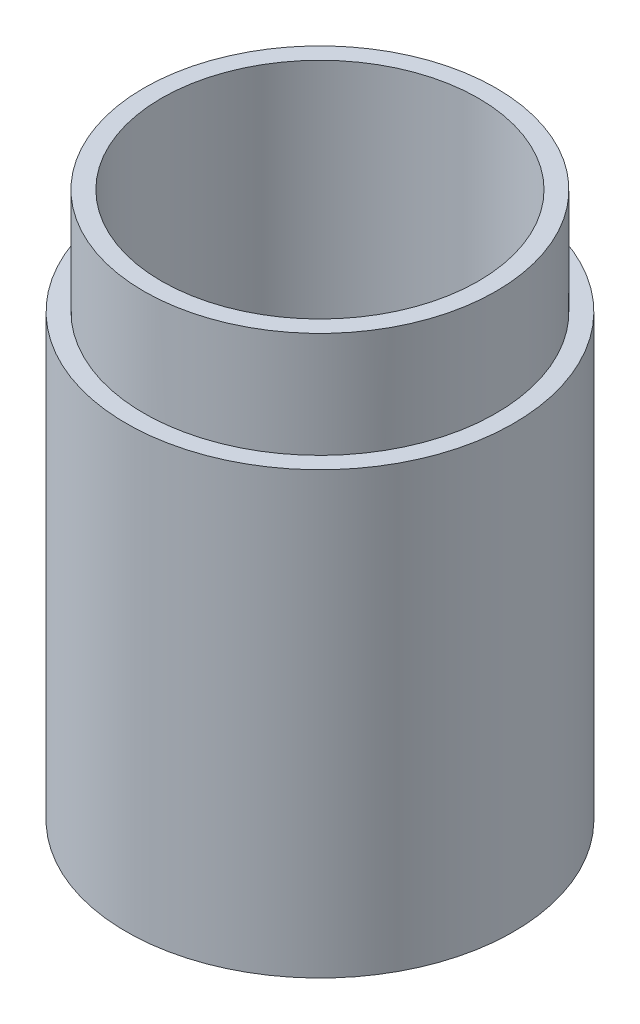
ISO-10303-21;
HEADER;
FILE_DESCRIPTION(('STEP AP214'),'2;1');
FILE_NAME('part.step','',(''),(''),'','','');
FILE_SCHEMA(('AUTOMOTIVE_DESIGN { 1 0 10303 214 1 1 1 1 }'));
ENDSEC;
DATA;
#1=APPLICATION_CONTEXT('core data for automotive mechanical design processes');
#2=APPLICATION_PROTOCOL_DEFINITION('international standard','automotive_design',2000,#1);
#3=PRODUCT_CONTEXT('',#1,'mechanical');
#4=PRODUCT('Part','Part','',(#3));
#5=PRODUCT_RELATED_PRODUCT_CATEGORY('part','',(#4));
#6=PRODUCT_DEFINITION_FORMATION('','',#4);
#7=PRODUCT_DEFINITION_CONTEXT('part definition',#1,'design');
#8=PRODUCT_DEFINITION('design','',#6,#7);
#9=PRODUCT_DEFINITION_SHAPE('','',#8);
#10=(LENGTH_UNIT() NAMED_UNIT(*) SI_UNIT(.MILLI.,.METRE.));
#11=(NAMED_UNIT(*) PLANE_ANGLE_UNIT() SI_UNIT($,.RADIAN.));
#12=(NAMED_UNIT(*) SI_UNIT($,.STERADIAN.) SOLID_ANGLE_UNIT());
#13=UNCERTAINTY_MEASURE_WITH_UNIT(LENGTH_MEASURE(1.E-05),#10,'distance_accuracy_value','');
#14=(GEOMETRIC_REPRESENTATION_CONTEXT(3) GLOBAL_UNCERTAINTY_ASSIGNED_CONTEXT((#13)) GLOBAL_UNIT_ASSIGNED_CONTEXT((#10,
#11,#12)) REPRESENTATION_CONTEXT('',''));
#15=CARTESIAN_POINT('',(0.,0.,0.));
#16=DIRECTION('',(0.,0.,1.));
#17=DIRECTION('',(1.,0.,0.));
#18=AXIS2_PLACEMENT_3D('',#15,#16,#17);
#19=CARTESIAN_POINT('',(0.,150.,0.));
#20=DIRECTION('',(0.,-1.,0.));
#21=DIRECTION('',(0.,0.,-1.));
#22=AXIS2_PLACEMENT_3D('',#19,#20,#21);
#23=CYLINDRICAL_SURFACE('',#22,50.);
#24=CARTESIAN_POINT('',(0.,150.,0.));
#25=DIRECTION('',(0.,1.,0.));
#26=DIRECTION('',(0.,0.,1.));
#27=AXIS2_PLACEMENT_3D('',#24,#25,#26);
#28=CIRCLE('',#27,50.);
#29=CARTESIAN_POINT('',(0.,150.,50.));
#30=VERTEX_POINT('',#29);
#31=EDGE_CURVE('E45',#30,#30,#28,.T.);
#32=ORIENTED_EDGE('',*,*,#31,.F.);
#33=EDGE_LOOP('',(#32));
#34=FACE_BOUND('',#33,.T.);
#35=CARTESIAN_POINT('',(0.,120.,0.));
#36=DIRECTION('',(0.,-1.,0.));
#37=DIRECTION('',(0.,0.,-1.));
#38=AXIS2_PLACEMENT_3D('',#35,#36,#37);
#39=CIRCLE('',#38,50.);
#40=CARTESIAN_POINT('',(0.,120.,-50.));
#41=VERTEX_POINT('',#40);
#42=EDGE_CURVE('E10',#41,#41,#39,.T.);
#43=ORIENTED_EDGE('',*,*,#42,.F.);
#44=EDGE_LOOP('',(#43));
#45=FACE_BOUND('',#44,.T.);
#46=ADVANCED_FACE('F37',(#34,#45),#23,.T.);
#47=CARTESIAN_POINT('',(0.,150.,0.));
#48=DIRECTION('',(0.,1.,0.));
#49=DIRECTION('',(0.,0.,1.));
#50=AXIS2_PLACEMENT_3D('',#47,#48,#49);
#51=PLANE('',#50);
#52=CARTESIAN_POINT('',(0.,150.,0.));
#53=DIRECTION('',(0.,1.,0.));
#54=DIRECTION('',(0.,0.,1.));
#55=AXIS2_PLACEMENT_3D('',#52,#53,#54);
#56=CIRCLE('',#55,45.);
#57=CARTESIAN_POINT('',(0.,150.,45.));
#58=VERTEX_POINT('',#57);
#59=EDGE_CURVE('E50',#58,#58,#56,.T.);
#60=ORIENTED_EDGE('',*,*,#59,.F.);
#61=EDGE_LOOP('',(#60));
#62=FACE_BOUND('',#61,.T.);
#63=ORIENTED_EDGE('',*,*,#31,.T.);
#64=EDGE_LOOP('',(#63));
#65=FACE_BOUND('',#64,.T.);
#66=ADVANCED_FACE('F84',(#62,#65),#51,.T.);
#67=CARTESIAN_POINT('',(0.,150.,0.));
#68=DIRECTION('',(0.,-1.,0.));
#69=DIRECTION('',(0.,0.,-1.));
#70=AXIS2_PLACEMENT_3D('',#67,#68,#69);
#71=CYLINDRICAL_SURFACE('',#70,45.);
#72=ORIENTED_EDGE('',*,*,#59,.T.);
#73=EDGE_LOOP('',(#72));
#74=FACE_BOUND('',#73,.T.);
#75=CARTESIAN_POINT('',(0.,0.,0.));
#76=DIRECTION('',(0.,1.,0.));
#77=DIRECTION('',(0.,0.,1.));
#78=AXIS2_PLACEMENT_3D('',#75,#76,#77);
#79=CIRCLE('',#78,45.);
#80=CARTESIAN_POINT('',(0.,0.,45.));
#81=VERTEX_POINT('',#80);
#82=EDGE_CURVE('E55',#81,#81,#79,.T.);
#83=ORIENTED_EDGE('',*,*,#82,.F.);
#84=EDGE_LOOP('',(#83));
#85=FACE_BOUND('',#84,.T.);
#86=ADVANCED_FACE('F91',(#74,#85),#71,.F.);
#87=CARTESIAN_POINT('',(0.,0.,0.));
#88=DIRECTION('',(0.,1.,0.));
#89=DIRECTION('',(0.,0.,1.));
#90=AXIS2_PLACEMENT_3D('',#87,#88,#89);
#91=PLANE('',#90);
#92=ORIENTED_EDGE('',*,*,#82,.T.);
#93=EDGE_LOOP('',(#92));
#94=FACE_BOUND('',#93,.T.);
#95=ADVANCED_FACE('F81',(#94),#91,.T.);
#96=CARTESIAN_POINT('',(0.,120.,0.));
#97=DIRECTION('',(0.,-1.,0.));
#98=DIRECTION('',(0.,0.,-1.));
#99=AXIS2_PLACEMENT_3D('',#96,#97,#98);
#100=CYLINDRICAL_SURFACE('',#99,55.);
#101=CARTESIAN_POINT('',(0.,120.,0.));
#102=DIRECTION('',(0.,-1.,0.));
#103=DIRECTION('',(0.,0.,-1.));
#104=AXIS2_PLACEMENT_3D('',#101,#102,#103);
#105=CIRCLE('',#104,55.);
#106=CARTESIAN_POINT('',(0.,120.,-55.));
#107=VERTEX_POINT('',#106);
#108=EDGE_CURVE('E60',#107,#107,#105,.T.);
#109=ORIENTED_EDGE('',*,*,#108,.T.);
#110=EDGE_LOOP('',(#109));
#111=FACE_BOUND('',#110,.T.);
#112=CARTESIAN_POINT('',(0.,-5.,0.));
#113=DIRECTION('',(0.,-1.,0.));
#114=DIRECTION('',(0.,0.,-1.));
#115=AXIS2_PLACEMENT_3D('',#112,#113,#114);
#116=CIRCLE('',#115,55.);
#117=CARTESIAN_POINT('',(0.,-5.,-55.));
#118=VERTEX_POINT('',#117);
#119=EDGE_CURVE('E62',#118,#118,#116,.T.);
#120=ORIENTED_EDGE('',*,*,#119,.F.);
#121=EDGE_LOOP('',(#120));
#122=FACE_BOUND('',#121,.T.);
#123=ADVANCED_FACE('F70',(#111,#122),#100,.T.);
#124=CARTESIAN_POINT('',(0.,120.,0.));
#125=DIRECTION('',(0.,-1.,0.));
#126=DIRECTION('',(0.,0.,-1.));
#127=AXIS2_PLACEMENT_3D('',#124,#125,#126);
#128=PLANE('',#127);
#129=ORIENTED_EDGE('',*,*,#42,.T.);
#130=EDGE_LOOP('',(#129));
#131=FACE_BOUND('',#130,.T.);
#132=ORIENTED_EDGE('',*,*,#108,.F.);
#133=EDGE_LOOP('',(#132));
#134=FACE_BOUND('',#133,.T.);
#135=ADVANCED_FACE('F73',(#131,#134),#128,.F.);
#136=CARTESIAN_POINT('',(0.,-5.,0.));
#137=DIRECTION('',(0.,1.,0.));
#138=DIRECTION('',(0.,0.,1.));
#139=AXIS2_PLACEMENT_3D('',#136,#137,#138);
#140=PLANE('',#139);
#141=ORIENTED_EDGE('',*,*,#119,.T.);
#142=EDGE_LOOP('',(#141));
#143=FACE_BOUND('',#142,.T.);
#144=ADVANCED_FACE('F39',(#143),#140,.F.);
#145=CLOSED_SHELL('',(#46,#66,#86,#95,#123,#135,#144));
#146=MANIFOLD_SOLID_BREP('B2',#145);
#147=ADVANCED_BREP_SHAPE_REPRESENTATION('',(#18,#146),#14);
#148=SHAPE_DEFINITION_REPRESENTATION(#9,#147);
ENDSEC;
END-ISO-10303-21;
